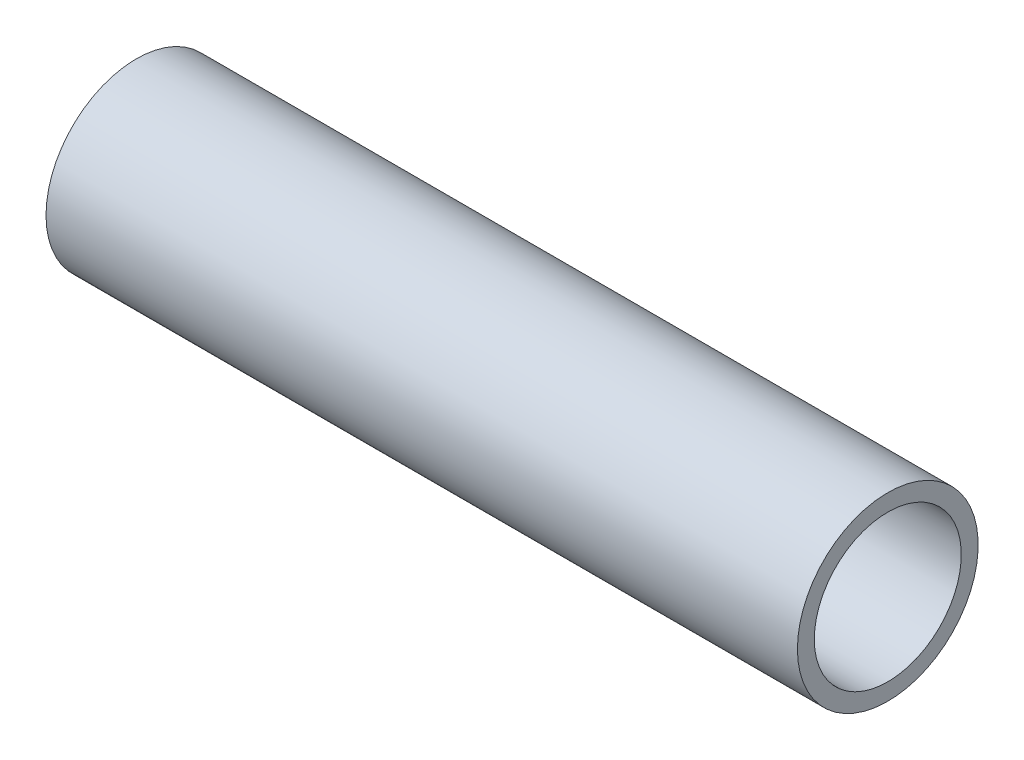
ISO-10303-21;
HEADER;
FILE_DESCRIPTION(('STEP AP214'),'2;1');
FILE_NAME('part.step','',(''),(''),'','','');
FILE_SCHEMA(('AUTOMOTIVE_DESIGN { 1 0 10303 214 1 1 1 1 }'));
ENDSEC;
DATA;
#1=APPLICATION_CONTEXT('core data for automotive mechanical design processes');
#2=APPLICATION_PROTOCOL_DEFINITION('international standard','automotive_design',2000,#1);
#3=PRODUCT_CONTEXT('',#1,'mechanical');
#4=PRODUCT('Part','Part','',(#3));
#5=PRODUCT_RELATED_PRODUCT_CATEGORY('part','',(#4));
#6=PRODUCT_DEFINITION_FORMATION('','',#4);
#7=PRODUCT_DEFINITION_CONTEXT('part definition',#1,'design');
#8=PRODUCT_DEFINITION('design','',#6,#7);
#9=PRODUCT_DEFINITION_SHAPE('','',#8);
#10=(LENGTH_UNIT() NAMED_UNIT(*) SI_UNIT(.MILLI.,.METRE.));
#11=(NAMED_UNIT(*) PLANE_ANGLE_UNIT() SI_UNIT($,.RADIAN.));
#12=(NAMED_UNIT(*) SI_UNIT($,.STERADIAN.) SOLID_ANGLE_UNIT());
#13=UNCERTAINTY_MEASURE_WITH_UNIT(LENGTH_MEASURE(1.E-05),#10,'distance_accuracy_value','');
#14=(GEOMETRIC_REPRESENTATION_CONTEXT(3) GLOBAL_UNCERTAINTY_ASSIGNED_CONTEXT((#13)) GLOBAL_UNIT_ASSIGNED_CONTEXT((#10,
#11,#12)) REPRESENTATION_CONTEXT('',''));
#15=CARTESIAN_POINT('',(0.,0.,0.));
#16=DIRECTION('',(0.,0.,1.));
#17=DIRECTION('',(1.,0.,0.));
#18=AXIS2_PLACEMENT_3D('',#15,#16,#17);
#19=CARTESIAN_POINT('',(-1000.,0.,0.));
#20=DIRECTION('',(-1.,0.,0.));
#21=DIRECTION('',(0.,0.,1.));
#22=AXIS2_PLACEMENT_3D('',#19,#20,#21);
#23=CYLINDRICAL_SURFACE('',#22,3.8735);
#24=CARTESIAN_POINT('',(19.8,0.,0.));
#25=DIRECTION('',(-1.,0.,0.));
#26=DIRECTION('',(0.,0.,1.));
#27=AXIS2_PLACEMENT_3D('',#24,#25,#26);
#28=CIRCLE('',#27,3.8735);
#29=CARTESIAN_POINT('',(19.8,0.,3.8735));
#30=VERTEX_POINT('',#29);
#31=EDGE_CURVE('E52',#30,#30,#28,.T.);
#32=ORIENTED_EDGE('',*,*,#31,.F.);
#33=EDGE_LOOP('',(#32));
#34=FACE_BOUND('',#33,.T.);
#35=CARTESIAN_POINT('',(-19.8,0.,0.));
#36=DIRECTION('',(-1.,0.,0.));
#37=DIRECTION('',(0.,0.,1.));
#38=AXIS2_PLACEMENT_3D('',#35,#36,#37);
#39=CIRCLE('',#38,3.8735);
#40=CARTESIAN_POINT('',(-19.8,0.,3.8735));
#41=VERTEX_POINT('',#40);
#42=EDGE_CURVE('E10',#41,#41,#39,.T.);
#43=ORIENTED_EDGE('',*,*,#42,.T.);
#44=EDGE_LOOP('',(#43));
#45=FACE_BOUND('',#44,.T.);
#46=ADVANCED_FACE('F39',(#34,#45),#23,.F.);
#47=CARTESIAN_POINT('',(-19.8,3.8735,0.));
#48=DIRECTION('',(1.,0.,0.));
#49=DIRECTION('',(0.,0.,-1.));
#50=AXIS2_PLACEMENT_3D('',#47,#48,#49);
#51=PLANE('',#50);
#52=ORIENTED_EDGE('',*,*,#42,.F.);
#53=EDGE_LOOP('',(#52));
#54=FACE_BOUND('',#53,.T.);
#55=CARTESIAN_POINT('',(-19.8,0.,0.));
#56=DIRECTION('',(-1.,0.,0.));
#57=DIRECTION('',(0.,0.,1.));
#58=AXIS2_PLACEMENT_3D('',#55,#56,#57);
#59=CIRCLE('',#58,4.7625);
#60=CARTESIAN_POINT('',(-19.8,0.,4.7625));
#61=VERTEX_POINT('',#60);
#62=EDGE_CURVE('E44',#61,#61,#59,.T.);
#63=ORIENTED_EDGE('',*,*,#62,.T.);
#64=EDGE_LOOP('',(#63));
#65=FACE_BOUND('',#64,.T.);
#66=ADVANCED_FACE('F65',(#54,#65),#51,.F.);
#67=CARTESIAN_POINT('',(-1000.,0.,0.));
#68=DIRECTION('',(-1.,0.,0.));
#69=DIRECTION('',(0.,0.,1.));
#70=AXIS2_PLACEMENT_3D('',#67,#68,#69);
#71=CYLINDRICAL_SURFACE('',#70,4.7625);
#72=ORIENTED_EDGE('',*,*,#62,.F.);
#73=EDGE_LOOP('',(#72));
#74=FACE_BOUND('',#73,.T.);
#75=CARTESIAN_POINT('',(19.8,0.,0.));
#76=DIRECTION('',(-1.,0.,0.));
#77=DIRECTION('',(0.,0.,1.));
#78=AXIS2_PLACEMENT_3D('',#75,#76,#77);
#79=CIRCLE('',#78,4.7625);
#80=CARTESIAN_POINT('',(19.8,0.,4.7625));
#81=VERTEX_POINT('',#80);
#82=EDGE_CURVE('E47',#81,#81,#79,.T.);
#83=ORIENTED_EDGE('',*,*,#82,.T.);
#84=EDGE_LOOP('',(#83));
#85=FACE_BOUND('',#84,.T.);
#86=ADVANCED_FACE('F67',(#74,#85),#71,.T.);
#87=CARTESIAN_POINT('',(19.8,4.7625,0.));
#88=DIRECTION('',(-1.,0.,0.));
#89=DIRECTION('',(0.,0.,1.));
#90=AXIS2_PLACEMENT_3D('',#87,#88,#89);
#91=PLANE('',#90);
#92=ORIENTED_EDGE('',*,*,#82,.F.);
#93=EDGE_LOOP('',(#92));
#94=FACE_BOUND('',#93,.T.);
#95=ORIENTED_EDGE('',*,*,#31,.T.);
#96=EDGE_LOOP('',(#95));
#97=FACE_BOUND('',#96,.T.);
#98=ADVANCED_FACE('F56',(#94,#97),#91,.F.);
#99=CLOSED_SHELL('',(#46,#66,#86,#98));
#100=MANIFOLD_SOLID_BREP('B2',#99);
#101=ADVANCED_BREP_SHAPE_REPRESENTATION('',(#18,#100),#14);
#102=SHAPE_DEFINITION_REPRESENTATION(#9,#101);
ENDSEC;
END-ISO-10303-21;
